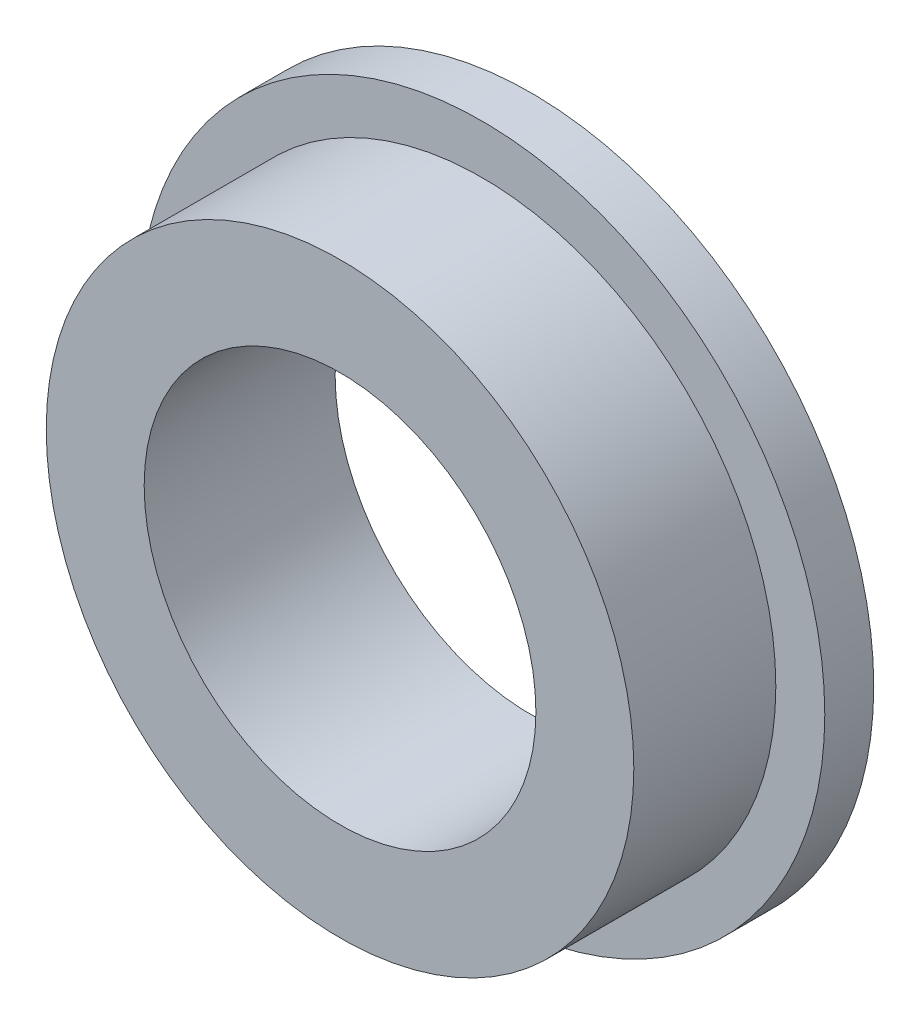
ISO-10303-21;
HEADER;
FILE_DESCRIPTION(('STEP AP214'),'2;1');
FILE_NAME('part.step','',(''),(''),'','','');
FILE_SCHEMA(('AUTOMOTIVE_DESIGN { 1 0 10303 214 1 1 1 1 }'));
ENDSEC;
DATA;
#1=APPLICATION_CONTEXT('core data for automotive mechanical design processes');
#2=APPLICATION_PROTOCOL_DEFINITION('international standard','automotive_design',2000,#1);
#3=PRODUCT_CONTEXT('',#1,'mechanical');
#4=PRODUCT('Part','Part','',(#3));
#5=PRODUCT_RELATED_PRODUCT_CATEGORY('part','',(#4));
#6=PRODUCT_DEFINITION_FORMATION('','',#4);
#7=PRODUCT_DEFINITION_CONTEXT('part definition',#1,'design');
#8=PRODUCT_DEFINITION('design','',#6,#7);
#9=PRODUCT_DEFINITION_SHAPE('','',#8);
#10=(LENGTH_UNIT() NAMED_UNIT(*) SI_UNIT(.MILLI.,.METRE.));
#11=(NAMED_UNIT(*) PLANE_ANGLE_UNIT() SI_UNIT($,.RADIAN.));
#12=(NAMED_UNIT(*) SI_UNIT($,.STERADIAN.) SOLID_ANGLE_UNIT());
#13=UNCERTAINTY_MEASURE_WITH_UNIT(LENGTH_MEASURE(1.E-05),#10,'distance_accuracy_value','');
#14=(GEOMETRIC_REPRESENTATION_CONTEXT(3) GLOBAL_UNCERTAINTY_ASSIGNED_CONTEXT((#13)) GLOBAL_UNIT_ASSIGNED_CONTEXT((#10,
#11,#12)) REPRESENTATION_CONTEXT('',''));
#15=CARTESIAN_POINT('',(0.,0.,0.));
#16=DIRECTION('',(0.,0.,1.));
#17=DIRECTION('',(1.,0.,0.));
#18=AXIS2_PLACEMENT_3D('',#15,#16,#17);
#19=CARTESIAN_POINT('',(0.,0.,1.));
#20=DIRECTION('',(0.,0.,1.));
#21=DIRECTION('',(1.,0.,0.));
#22=AXIS2_PLACEMENT_3D('',#19,#20,#21);
#23=PLANE('',#22);
#24=CARTESIAN_POINT('',(0.,0.,1.));
#25=DIRECTION('',(0.,0.,1.));
#26=DIRECTION('',(1.,0.,0.));
#27=AXIS2_PLACEMENT_3D('',#24,#25,#26);
#28=CIRCLE('',#27,6.);
#29=CARTESIAN_POINT('',(6.,0.,1.));
#30=VERTEX_POINT('',#29);
#31=EDGE_CURVE('E10',#30,#30,#28,.T.);
#32=ORIENTED_EDGE('',*,*,#31,.F.);
#33=EDGE_LOOP('',(#32));
#34=FACE_BOUND('',#33,.T.);
#35=CARTESIAN_POINT('',(0.,0.,1.));
#36=DIRECTION('',(0.,0.,1.));
#37=DIRECTION('',(1.,0.,0.));
#38=AXIS2_PLACEMENT_3D('',#35,#36,#37);
#39=CIRCLE('',#38,7.);
#40=CARTESIAN_POINT('',(7.,0.,1.));
#41=VERTEX_POINT('',#40);
#42=EDGE_CURVE('E41',#41,#41,#39,.T.);
#43=ORIENTED_EDGE('',*,*,#42,.T.);
#44=EDGE_LOOP('',(#43));
#45=FACE_BOUND('',#44,.T.);
#46=ADVANCED_FACE('F33',(#34,#45),#23,.T.);
#47=CARTESIAN_POINT('',(0.,0.,0.));
#48=DIRECTION('',(0.,0.,1.));
#49=DIRECTION('',(1.,0.,0.));
#50=AXIS2_PLACEMENT_3D('',#47,#48,#49);
#51=PLANE('',#50);
#52=CARTESIAN_POINT('',(0.,0.,0.));
#53=DIRECTION('',(0.,0.,1.));
#54=DIRECTION('',(1.,0.,0.));
#55=AXIS2_PLACEMENT_3D('',#52,#53,#54);
#56=CIRCLE('',#55,7.);
#57=CARTESIAN_POINT('',(7.,0.,0.));
#58=VERTEX_POINT('',#57);
#59=EDGE_CURVE('E37',#58,#58,#56,.T.);
#60=ORIENTED_EDGE('',*,*,#59,.F.);
#61=EDGE_LOOP('',(#60));
#62=FACE_BOUND('',#61,.T.);
#63=CARTESIAN_POINT('',(0.,0.,0.));
#64=DIRECTION('',(0.,0.,1.));
#65=DIRECTION('',(1.,0.,0.));
#66=AXIS2_PLACEMENT_3D('',#63,#64,#65);
#67=CIRCLE('',#66,4.);
#68=CARTESIAN_POINT('',(4.,0.,0.));
#69=VERTEX_POINT('',#68);
#70=EDGE_CURVE('E50',#69,#69,#67,.T.);
#71=ORIENTED_EDGE('',*,*,#70,.T.);
#72=EDGE_LOOP('',(#71));
#73=FACE_BOUND('',#72,.T.);
#74=ADVANCED_FACE('F77',(#62,#73),#51,.F.);
#75=CARTESIAN_POINT('',(0.,0.,1.));
#76=DIRECTION('',(0.,0.,-1.));
#77=DIRECTION('',(-1.,0.,0.));
#78=AXIS2_PLACEMENT_3D('',#75,#76,#77);
#79=CYLINDRICAL_SURFACE('',#78,7.);
#80=ORIENTED_EDGE('',*,*,#42,.F.);
#81=EDGE_LOOP('',(#80));
#82=FACE_BOUND('',#81,.T.);
#83=ORIENTED_EDGE('',*,*,#59,.T.);
#84=EDGE_LOOP('',(#83));
#85=FACE_BOUND('',#84,.T.);
#86=ADVANCED_FACE('F35',(#82,#85),#79,.T.);
#87=CARTESIAN_POINT('',(0.,0.,1.));
#88=DIRECTION('',(0.,0.,-1.));
#89=DIRECTION('',(-1.,0.,0.));
#90=AXIS2_PLACEMENT_3D('',#87,#88,#89);
#91=CYLINDRICAL_SURFACE('',#90,4.);
#92=ORIENTED_EDGE('',*,*,#70,.F.);
#93=EDGE_LOOP('',(#92));
#94=FACE_BOUND('',#93,.T.);
#95=CARTESIAN_POINT('',(0.,0.,3.9));
#96=DIRECTION('',(0.,0.,1.));
#97=DIRECTION('',(1.,0.,0.));
#98=AXIS2_PLACEMENT_3D('',#95,#96,#97);
#99=CIRCLE('',#98,4.);
#100=CARTESIAN_POINT('',(4.,0.,3.9));
#101=VERTEX_POINT('',#100);
#102=EDGE_CURVE('E56',#101,#101,#99,.T.);
#103=ORIENTED_EDGE('',*,*,#102,.T.);
#104=EDGE_LOOP('',(#103));
#105=FACE_BOUND('',#104,.T.);
#106=ADVANCED_FACE('F62',(#94,#105),#91,.F.);
#107=CARTESIAN_POINT('',(0.,0.,3.9));
#108=DIRECTION('',(0.,0.,1.));
#109=DIRECTION('',(1.,0.,0.));
#110=AXIS2_PLACEMENT_3D('',#107,#108,#109);
#111=PLANE('',#110);
#112=CARTESIAN_POINT('',(0.,0.,3.9));
#113=DIRECTION('',(0.,0.,1.));
#114=DIRECTION('',(1.,0.,0.));
#115=AXIS2_PLACEMENT_3D('',#112,#113,#114);
#116=CIRCLE('',#115,6.);
#117=CARTESIAN_POINT('',(6.,0.,3.9));
#118=VERTEX_POINT('',#117);
#119=EDGE_CURVE('E48',#118,#118,#116,.T.);
#120=ORIENTED_EDGE('',*,*,#119,.T.);
#121=EDGE_LOOP('',(#120));
#122=FACE_BOUND('',#121,.T.);
#123=ORIENTED_EDGE('',*,*,#102,.F.);
#124=EDGE_LOOP('',(#123));
#125=FACE_BOUND('',#124,.T.);
#126=ADVANCED_FACE('F64',(#122,#125),#111,.T.);
#127=CARTESIAN_POINT('',(0.,0.,3.9));
#128=DIRECTION('',(0.,0.,-1.));
#129=DIRECTION('',(-1.,0.,0.));
#130=AXIS2_PLACEMENT_3D('',#127,#128,#129);
#131=CYLINDRICAL_SURFACE('',#130,6.);
#132=ORIENTED_EDGE('',*,*,#119,.F.);
#133=EDGE_LOOP('',(#132));
#134=FACE_BOUND('',#133,.T.);
#135=ORIENTED_EDGE('',*,*,#31,.T.);
#136=EDGE_LOOP('',(#135));
#137=FACE_BOUND('',#136,.T.);
#138=ADVANCED_FACE('F66',(#134,#137),#131,.T.);
#139=CLOSED_SHELL('',(#46,#74,#86,#106,#126,#138));
#140=MANIFOLD_SOLID_BREP('B2',#139);
#141=ADVANCED_BREP_SHAPE_REPRESENTATION('',(#18,#140),#14);
#142=SHAPE_DEFINITION_REPRESENTATION(#9,#141);
ENDSEC;
END-ISO-10303-21;
